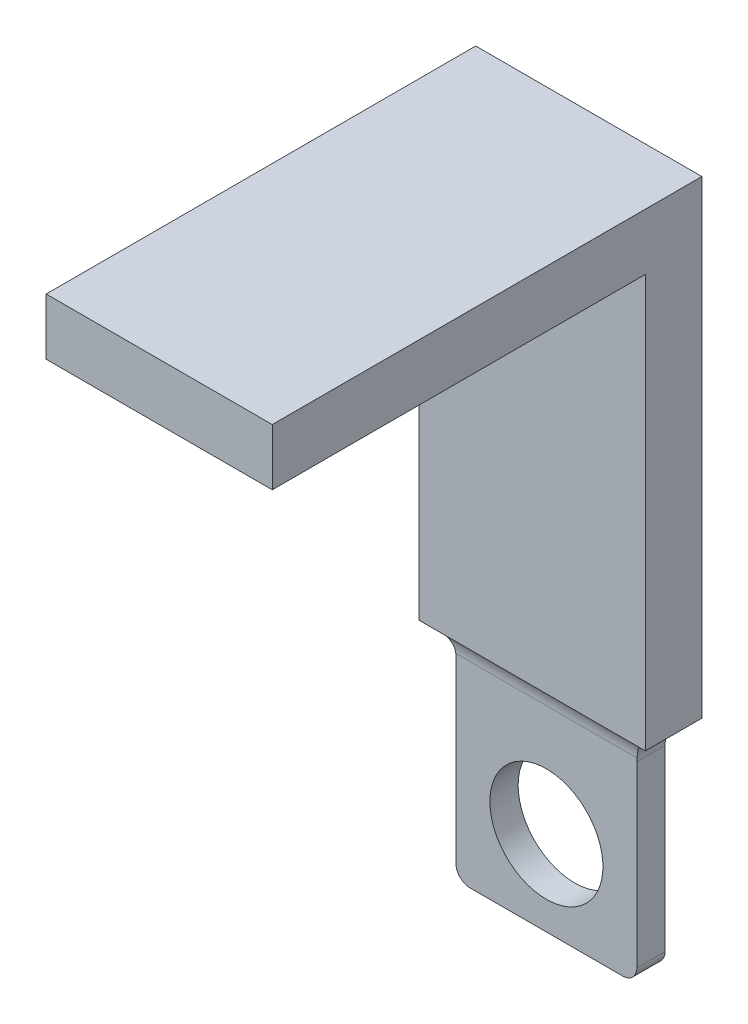
ISO-10303-21;
HEADER;
FILE_DESCRIPTION(('STEP AP214'),'2;1');
FILE_NAME('part.step','',(''),(''),'','','');
FILE_SCHEMA(('AUTOMOTIVE_DESIGN { 1 0 10303 214 1 1 1 1 }'));
ENDSEC;
DATA;
#1=APPLICATION_CONTEXT('core data for automotive mechanical design processes');
#2=APPLICATION_PROTOCOL_DEFINITION('international standard','automotive_design',2000,#1);
#3=PRODUCT_CONTEXT('',#1,'mechanical');
#4=PRODUCT('Part','Part','',(#3));
#5=PRODUCT_RELATED_PRODUCT_CATEGORY('part','',(#4));
#6=PRODUCT_DEFINITION_FORMATION('','',#4);
#7=PRODUCT_DEFINITION_CONTEXT('part definition',#1,'design');
#8=PRODUCT_DEFINITION('design','',#6,#7);
#9=PRODUCT_DEFINITION_SHAPE('','',#8);
#10=(LENGTH_UNIT() NAMED_UNIT(*) SI_UNIT(.MILLI.,.METRE.));
#11=(NAMED_UNIT(*) PLANE_ANGLE_UNIT() SI_UNIT($,.RADIAN.));
#12=(NAMED_UNIT(*) SI_UNIT($,.STERADIAN.) SOLID_ANGLE_UNIT());
#13=UNCERTAINTY_MEASURE_WITH_UNIT(LENGTH_MEASURE(1.E-05),#10,'distance_accuracy_value','');
#14=(GEOMETRIC_REPRESENTATION_CONTEXT(3) GLOBAL_UNCERTAINTY_ASSIGNED_CONTEXT((#13)) GLOBAL_UNIT_ASSIGNED_CONTEXT((#10,
#11,#12)) REPRESENTATION_CONTEXT('',''));
#15=CARTESIAN_POINT('',(0.,0.,0.));
#16=DIRECTION('',(0.,0.,1.));
#17=DIRECTION('',(1.,0.,0.));
#18=AXIS2_PLACEMENT_3D('',#15,#16,#17);
#19=CARTESIAN_POINT('',(0.,8.3,0.));
#20=DIRECTION('',(1.,0.,0.));
#21=DIRECTION('',(0.,0.,-1.));
#22=AXIS2_PLACEMENT_3D('',#19,#20,#21);
#23=PLANE('',#22);
#24=DIRECTION('',(0.,0.,1.));
#25=VECTOR('',#24,1.);
#26=CARTESIAN_POINT('',(0.,0.,0.));
#27=LINE('',#26,#25);
#28=CARTESIAN_POINT('',(0.,0.,0.));
#29=VERTEX_POINT('',#28);
#30=CARTESIAN_POINT('',(0.,0.,1.));
#31=VERTEX_POINT('',#30);
#32=EDGE_CURVE('E160',#29,#31,#27,.T.);
#33=ORIENTED_EDGE('',*,*,#32,.F.);
#34=DIRECTION('',(0.,-1.,0.));
#35=VECTOR('',#34,1.);
#36=CARTESIAN_POINT('',(0.,8.3,0.));
#37=LINE('',#36,#35);
#38=CARTESIAN_POINT('',(0.,8.3,0.));
#39=VERTEX_POINT('',#38);
#40=EDGE_CURVE('E181',#39,#29,#37,.T.);
#41=ORIENTED_EDGE('',*,*,#40,.F.);
#42=DIRECTION('',(0.,0.,1.));
#43=VECTOR('',#42,1.);
#44=CARTESIAN_POINT('',(0.,8.3,0.));
#45=LINE('',#44,#43);
#46=CARTESIAN_POINT('',(0.,8.3,7.6));
#47=VERTEX_POINT('',#46);
#48=EDGE_CURVE('E168',#39,#47,#45,.T.);
#49=ORIENTED_EDGE('',*,*,#48,.T.);
#50=DIRECTION('',(0.,1.,0.));
#51=VECTOR('',#50,1.);
#52=CARTESIAN_POINT('',(0.,8.3,7.6));
#53=LINE('',#52,#51);
#54=CARTESIAN_POINT('',(0.,7.3,7.6));
#55=VERTEX_POINT('',#54);
#56=EDGE_CURVE('E144',#55,#47,#53,.T.);
#57=ORIENTED_EDGE('',*,*,#56,.F.);
#58=DIRECTION('',(0.,0.,-1.));
#59=VECTOR('',#58,1.);
#60=CARTESIAN_POINT('',(0.,7.3,7.6));
#61=LINE('',#60,#59);
#62=CARTESIAN_POINT('',(0.,7.3,1.));
#63=VERTEX_POINT('',#62);
#64=EDGE_CURVE('E140',#55,#63,#61,.T.);
#65=ORIENTED_EDGE('',*,*,#64,.T.);
#66=DIRECTION('',(0.,-1.,0.));
#67=VECTOR('',#66,1.);
#68=CARTESIAN_POINT('',(0.,8.3,1.));
#69=LINE('',#68,#67);
#70=EDGE_CURVE('E174',#63,#31,#69,.T.);
#71=ORIENTED_EDGE('',*,*,#70,.T.);
#72=EDGE_LOOP('',(#33,#41,#49,#57,#65,#71));
#73=FACE_BOUND('',#72,.T.);
#74=ADVANCED_FACE('F32',(#73),#23,.T.);
#75=CARTESIAN_POINT('',(0.,8.3,0.));
#76=DIRECTION('',(0.,0.,1.));
#77=DIRECTION('',(1.,0.,0.));
#78=AXIS2_PLACEMENT_3D('',#75,#76,#77);
#79=PLANE('',#78);
#80=DIRECTION('',(-1.,0.,0.));
#81=VECTOR('',#80,1.);
#82=CARTESIAN_POINT('',(0.,0.,0.));
#83=LINE('',#82,#81);
#84=CARTESIAN_POINT('',(-4.,0.,0.));
#85=VERTEX_POINT('',#84);
#86=EDGE_CURVE('E171',#29,#85,#83,.T.);
#87=ORIENTED_EDGE('',*,*,#86,.T.);
#88=DIRECTION('',(0.,-1.,0.));
#89=VECTOR('',#88,1.);
#90=CARTESIAN_POINT('',(-4.,8.3,0.));
#91=LINE('',#90,#89);
#92=CARTESIAN_POINT('',(-4.,8.3,0.));
#93=VERTEX_POINT('',#92);
#94=EDGE_CURVE('E184',#93,#85,#91,.T.);
#95=ORIENTED_EDGE('',*,*,#94,.F.);
#96=DIRECTION('',(-1.,0.,0.));
#97=VECTOR('',#96,1.);
#98=CARTESIAN_POINT('',(0.,8.3,0.));
#99=LINE('',#98,#97);
#100=EDGE_CURVE('E173',#39,#93,#99,.T.);
#101=ORIENTED_EDGE('',*,*,#100,.F.);
#102=ORIENTED_EDGE('',*,*,#40,.T.);
#103=EDGE_LOOP('',(#87,#95,#101,#102));
#104=FACE_BOUND('',#103,.T.);
#105=ADVANCED_FACE('F271',(#104),#79,.F.);
#106=CARTESIAN_POINT('',(-4.,8.3,0.));
#107=DIRECTION('',(1.,0.,0.));
#108=DIRECTION('',(0.,0.,-1.));
#109=AXIS2_PLACEMENT_3D('',#106,#107,#108);
#110=PLANE('',#109);
#111=DIRECTION('',(0.,0.,1.));
#112=VECTOR('',#111,1.);
#113=CARTESIAN_POINT('',(-4.,0.,0.));
#114=LINE('',#113,#112);
#115=CARTESIAN_POINT('',(-4.,0.,1.));
#116=VERTEX_POINT('',#115);
#117=EDGE_CURVE('E178',#85,#116,#114,.T.);
#118=ORIENTED_EDGE('',*,*,#117,.T.);
#119=DIRECTION('',(0.,-1.,0.));
#120=VECTOR('',#119,1.);
#121=CARTESIAN_POINT('',(-4.,8.3,1.));
#122=LINE('',#121,#120);
#123=CARTESIAN_POINT('',(-4.,7.3,1.));
#124=VERTEX_POINT('',#123);
#125=EDGE_CURVE('E159',#124,#116,#122,.T.);
#126=ORIENTED_EDGE('',*,*,#125,.F.);
#127=DIRECTION('',(0.,0.,-1.));
#128=VECTOR('',#127,1.);
#129=CARTESIAN_POINT('',(-4.,7.3,7.6));
#130=LINE('',#129,#128);
#131=CARTESIAN_POINT('',(-4.,7.3,7.6));
#132=VERTEX_POINT('',#131);
#133=EDGE_CURVE('E138',#132,#124,#130,.T.);
#134=ORIENTED_EDGE('',*,*,#133,.F.);
#135=DIRECTION('',(0.,-1.,0.));
#136=VECTOR('',#135,1.);
#137=CARTESIAN_POINT('',(-4.,8.3,7.6));
#138=LINE('',#137,#136);
#139=CARTESIAN_POINT('',(-4.,8.3,7.6));
#140=VERTEX_POINT('',#139);
#141=EDGE_CURVE('E145',#140,#132,#138,.T.);
#142=ORIENTED_EDGE('',*,*,#141,.F.);
#143=DIRECTION('',(0.,0.,1.));
#144=VECTOR('',#143,1.);
#145=CARTESIAN_POINT('',(-4.,8.3,0.));
#146=LINE('',#145,#144);
#147=EDGE_CURVE('E170',#93,#140,#146,.T.);
#148=ORIENTED_EDGE('',*,*,#147,.F.);
#149=ORIENTED_EDGE('',*,*,#94,.T.);
#150=EDGE_LOOP('',(#118,#126,#134,#142,#148,#149));
#151=FACE_BOUND('',#150,.T.);
#152=ADVANCED_FACE('F158',(#151),#110,.F.);
#153=CARTESIAN_POINT('',(0.,8.3,1.));
#154=DIRECTION('',(0.,0.,1.));
#155=DIRECTION('',(1.,0.,0.));
#156=AXIS2_PLACEMENT_3D('',#153,#154,#155);
#157=PLANE('',#156);
#158=DIRECTION('',(1.,0.,0.));
#159=VECTOR('',#158,1.);
#160=CARTESIAN_POINT('',(-4.,7.3,1.));
#161=LINE('',#160,#159);
#162=EDGE_CURVE('E154',#124,#63,#161,.T.);
#163=ORIENTED_EDGE('',*,*,#162,.F.);
#164=ORIENTED_EDGE('',*,*,#125,.T.);
#165=DIRECTION('',(-1.,0.,0.));
#166=VECTOR('',#165,1.);
#167=CARTESIAN_POINT('',(0.,0.,1.));
#168=LINE('',#167,#166);
#169=EDGE_CURVE('E163',#31,#116,#168,.T.);
#170=ORIENTED_EDGE('',*,*,#169,.F.);
#171=ORIENTED_EDGE('',*,*,#70,.F.);
#172=EDGE_LOOP('',(#163,#164,#170,#171));
#173=FACE_BOUND('',#172,.T.);
#174=ADVANCED_FACE('F280',(#173),#157,.T.);
#175=CARTESIAN_POINT('',(0.,8.3,0.));
#176=DIRECTION('',(0.,-1.,0.));
#177=DIRECTION('',(0.,0.,-1.));
#178=AXIS2_PLACEMENT_3D('',#175,#176,#177);
#179=PLANE('',#178);
#180=ORIENTED_EDGE('',*,*,#48,.F.);
#181=ORIENTED_EDGE('',*,*,#100,.T.);
#182=ORIENTED_EDGE('',*,*,#147,.T.);
#183=DIRECTION('',(-1.,0.,0.));
#184=VECTOR('',#183,1.);
#185=CARTESIAN_POINT('',(-4.,8.3,7.6));
#186=LINE('',#185,#184);
#187=EDGE_CURVE('E151',#47,#140,#186,.T.);
#188=ORIENTED_EDGE('',*,*,#187,.F.);
#189=EDGE_LOOP('',(#180,#181,#182,#188));
#190=FACE_BOUND('',#189,.T.);
#191=ADVANCED_FACE('F283',(#190),#179,.F.);
#192=CARTESIAN_POINT('',(-4.,7.3,7.6));
#193=DIRECTION('',(0.,1.,0.));
#194=DIRECTION('',(0.,0.,1.));
#195=AXIS2_PLACEMENT_3D('',#192,#193,#194);
#196=PLANE('',#195);
#197=ORIENTED_EDGE('',*,*,#162,.T.);
#198=ORIENTED_EDGE('',*,*,#64,.F.);
#199=DIRECTION('',(1.,0.,0.));
#200=VECTOR('',#199,1.);
#201=CARTESIAN_POINT('',(-4.,7.3,7.6));
#202=LINE('',#201,#200);
#203=EDGE_CURVE('E133',#132,#55,#202,.T.);
#204=ORIENTED_EDGE('',*,*,#203,.F.);
#205=ORIENTED_EDGE('',*,*,#133,.T.);
#206=EDGE_LOOP('',(#197,#198,#204,#205));
#207=FACE_BOUND('',#206,.T.);
#208=ADVANCED_FACE('F136',(#207),#196,.F.);
#209=CARTESIAN_POINT('',(0.,0.,7.6));
#210=DIRECTION('',(0.,0.,1.));
#211=DIRECTION('',(1.,0.,0.));
#212=AXIS2_PLACEMENT_3D('',#209,#210,#211);
#213=PLANE('',#212);
#214=ORIENTED_EDGE('',*,*,#141,.T.);
#215=ORIENTED_EDGE('',*,*,#203,.T.);
#216=ORIENTED_EDGE('',*,*,#56,.T.);
#217=ORIENTED_EDGE('',*,*,#187,.T.);
#218=EDGE_LOOP('',(#214,#215,#216,#217));
#219=FACE_BOUND('',#218,.T.);
#220=ADVANCED_FACE('F149',(#219),#213,.T.);
#221=CARTESIAN_POINT('',(-0.4,-3.9,0.25));
#222=DIRECTION('',(-1.,0.,0.));
#223=DIRECTION('',(0.,0.,1.));
#224=AXIS2_PLACEMENT_3D('',#221,#222,#223);
#225=PLANE('',#224);
#226=DIRECTION('',(0.,1.,0.));
#227=VECTOR('',#226,1.);
#228=CARTESIAN_POINT('',(-0.4,-3.9,0.75));
#229=LINE('',#228,#227);
#230=CARTESIAN_POINT('',(-0.4,-3.65,0.75));
#231=VERTEX_POINT('',#230);
#232=CARTESIAN_POINT('',(-0.4,-0.489897948556636,0.75));
#233=VERTEX_POINT('',#232);
#234=EDGE_CURVE('E337',#231,#233,#229,.T.);
#235=ORIENTED_EDGE('',*,*,#234,.F.);
#236=DIRECTION('',(0.,0.,1.));
#237=VECTOR('',#236,1.);
#238=CARTESIAN_POINT('',(-0.4,-3.65,0.25));
#239=LINE('',#238,#237);
#240=CARTESIAN_POINT('',(-0.4,-3.65,0.25));
#241=VERTEX_POINT('',#240);
#242=EDGE_CURVE('E55',#231,#241,#239,.F.);
#243=ORIENTED_EDGE('',*,*,#242,.T.);
#244=DIRECTION('',(0.,1.,0.));
#245=VECTOR('',#244,1.);
#246=CARTESIAN_POINT('',(-0.4,-3.9,0.25));
#247=LINE('',#246,#245);
#248=CARTESIAN_POINT('',(-0.4,-0.489897948556636,0.25));
#249=VERTEX_POINT('',#248);
#250=EDGE_CURVE('E331',#241,#249,#247,.T.);
#251=ORIENTED_EDGE('',*,*,#250,.T.);
#252=DIRECTION('',(0.,0.,1.));
#253=VECTOR('',#252,1.);
#254=CARTESIAN_POINT('',(-0.4,-0.489897948556636,0.25));
#255=LINE('',#254,#253);
#256=EDGE_CURVE('E196',#249,#233,#255,.T.);
#257=ORIENTED_EDGE('',*,*,#256,.T.);
#258=EDGE_LOOP('',(#235,#243,#251,#257));
#259=FACE_BOUND('',#258,.T.);
#260=ADVANCED_FACE('F294',(#259),#225,.F.);
#261=CARTESIAN_POINT('',(-3.6,-3.9,0.75));
#262=DIRECTION('',(0.,0.,-1.));
#263=DIRECTION('',(-1.,0.,0.));
#264=AXIS2_PLACEMENT_3D('',#261,#262,#263);
#265=PLANE('',#264);
#266=CARTESIAN_POINT('',(-2.,-2.39907314828926,0.75));
#267=DIRECTION('',(0.,0.,-1.));
#268=DIRECTION('',(-1.,0.,0.));
#269=AXIS2_PLACEMENT_3D('',#266,#267,#268);
#270=CIRCLE('',#269,1.);
#271=CARTESIAN_POINT('',(-3.,-2.39907314828926,0.75));
#272=VERTEX_POINT('',#271);
#273=EDGE_CURVE('E222',#272,#272,#270,.T.);
#274=ORIENTED_EDGE('',*,*,#273,.T.);
#275=EDGE_LOOP('',(#274));
#276=FACE_BOUND('',#275,.T.);
#277=DIRECTION('',(-1.,0.,0.));
#278=VECTOR('',#277,1.);
#279=CARTESIAN_POINT('',(-3.6,-3.9,0.75));
#280=LINE('',#279,#278);
#281=CARTESIAN_POINT('',(-0.65,-3.9,0.75));
#282=VERTEX_POINT('',#281);
#283=CARTESIAN_POINT('',(-3.35,-3.9,0.75));
#284=VERTEX_POINT('',#283);
#285=EDGE_CURVE('E325',#282,#284,#280,.T.);
#286=ORIENTED_EDGE('',*,*,#285,.F.);
#287=CARTESIAN_POINT('',(-0.65,-3.65,0.75));
#288=DIRECTION('',(0.,0.,-1.));
#289=DIRECTION('',(-1.,0.,0.));
#290=AXIS2_PLACEMENT_3D('',#287,#288,#289);
#291=CIRCLE('',#290,0.25);
#292=EDGE_CURVE('E363',#282,#231,#291,.F.);
#293=ORIENTED_EDGE('',*,*,#292,.T.);
#294=ORIENTED_EDGE('',*,*,#234,.T.);
#295=CARTESIAN_POINT('',(0.1,-0.489897948556636,0.75));
#296=DIRECTION('',(0.,0.,-1.));
#297=DIRECTION('',(-1.,0.,0.));
#298=AXIS2_PLACEMENT_3D('',#295,#296,#297);
#299=CIRCLE('',#298,0.5);
#300=CARTESIAN_POINT('',(-0.396753529138876,-0.433012701892219,0.75));
#301=VERTEX_POINT('',#300);
#302=EDGE_CURVE('E205',#233,#301,#299,.T.);
#303=ORIENTED_EDGE('',*,*,#302,.T.);
#304=DIRECTION('',(-1.,0.,0.));
#305=VECTOR('',#304,1.);
#306=CARTESIAN_POINT('',(-3.6,-0.433012701892219,0.75));
#307=LINE('',#306,#305);
#308=CARTESIAN_POINT('',(-3.60324647086112,-0.433012701892219,0.75));
#309=VERTEX_POINT('',#308);
#310=EDGE_CURVE('E183',#301,#309,#307,.T.);
#311=ORIENTED_EDGE('',*,*,#310,.T.);
#312=CARTESIAN_POINT('',(-4.1,-0.489897948556636,0.75));
#313=DIRECTION('',(0.,0.,-1.));
#314=DIRECTION('',(-1.,0.,0.));
#315=AXIS2_PLACEMENT_3D('',#312,#313,#314);
#316=CIRCLE('',#315,0.5);
#317=CARTESIAN_POINT('',(-3.6,-0.489897948556636,0.75));
#318=VERTEX_POINT('',#317);
#319=EDGE_CURVE('E202',#309,#318,#316,.T.);
#320=ORIENTED_EDGE('',*,*,#319,.T.);
#321=DIRECTION('',(0.,1.,0.));
#322=VECTOR('',#321,1.);
#323=CARTESIAN_POINT('',(-3.6,-3.9,0.75));
#324=LINE('',#323,#322);
#325=CARTESIAN_POINT('',(-3.6,-3.65,0.75));
#326=VERTEX_POINT('',#325);
#327=EDGE_CURVE('E335',#326,#318,#324,.T.);
#328=ORIENTED_EDGE('',*,*,#327,.F.);
#329=CARTESIAN_POINT('',(-3.35,-3.65,0.75));
#330=DIRECTION('',(0.,0.,-1.));
#331=DIRECTION('',(-1.,0.,0.));
#332=AXIS2_PLACEMENT_3D('',#329,#330,#331);
#333=CIRCLE('',#332,0.25);
#334=EDGE_CURVE('E368',#326,#284,#333,.F.);
#335=ORIENTED_EDGE('',*,*,#334,.T.);
#336=EDGE_LOOP('',(#286,#293,#294,#303,#311,#320,#328,#335));
#337=FACE_BOUND('',#336,.T.);
#338=ADVANCED_FACE('F297',(#276,#337),#265,.F.);
#339=CARTESIAN_POINT('',(-3.6,-3.9,0.25));
#340=DIRECTION('',(1.,0.,0.));
#341=DIRECTION('',(0.,0.,-1.));
#342=AXIS2_PLACEMENT_3D('',#339,#340,#341);
#343=PLANE('',#342);
#344=DIRECTION('',(0.,1.,0.));
#345=VECTOR('',#344,1.);
#346=CARTESIAN_POINT('',(-3.6,-3.9,0.25));
#347=LINE('',#346,#345);
#348=CARTESIAN_POINT('',(-3.6,-3.65,0.25));
#349=VERTEX_POINT('',#348);
#350=CARTESIAN_POINT('',(-3.6,-0.489897948556636,0.25));
#351=VERTEX_POINT('',#350);
#352=EDGE_CURVE('E333',#349,#351,#347,.T.);
#353=ORIENTED_EDGE('',*,*,#352,.F.);
#354=DIRECTION('',(0.,0.,-1.));
#355=VECTOR('',#354,1.);
#356=CARTESIAN_POINT('',(-3.6,-3.65,0.25));
#357=LINE('',#356,#355);
#358=EDGE_CURVE('E11',#349,#326,#357,.F.);
#359=ORIENTED_EDGE('',*,*,#358,.T.);
#360=ORIENTED_EDGE('',*,*,#327,.T.);
#361=DIRECTION('',(0.,0.,1.));
#362=VECTOR('',#361,1.);
#363=CARTESIAN_POINT('',(-3.6,-0.489897948556636,0.25));
#364=LINE('',#363,#362);
#365=EDGE_CURVE('E191',#318,#351,#364,.F.);
#366=ORIENTED_EDGE('',*,*,#365,.T.);
#367=EDGE_LOOP('',(#353,#359,#360,#366));
#368=FACE_BOUND('',#367,.T.);
#369=ADVANCED_FACE('F300',(#368),#343,.F.);
#370=CARTESIAN_POINT('',(-3.6,-3.9,0.25));
#371=DIRECTION('',(0.,0.,1.));
#372=DIRECTION('',(1.,0.,0.));
#373=AXIS2_PLACEMENT_3D('',#370,#371,#372);
#374=PLANE('',#373);
#375=CARTESIAN_POINT('',(-2.,-2.39907314828926,0.25));
#376=DIRECTION('',(0.,0.,-1.));
#377=DIRECTION('',(-1.,0.,0.));
#378=AXIS2_PLACEMENT_3D('',#375,#376,#377);
#379=CIRCLE('',#378,1.);
#380=CARTESIAN_POINT('',(-3.,-2.39907314828926,0.25));
#381=VERTEX_POINT('',#380);
#382=EDGE_CURVE('E319',#381,#381,#379,.T.);
#383=ORIENTED_EDGE('',*,*,#382,.F.);
#384=EDGE_LOOP('',(#383));
#385=FACE_BOUND('',#384,.T.);
#386=ORIENTED_EDGE('',*,*,#250,.F.);
#387=CARTESIAN_POINT('',(-0.65,-3.65,0.25));
#388=DIRECTION('',(0.,0.,1.));
#389=DIRECTION('',(1.,0.,0.));
#390=AXIS2_PLACEMENT_3D('',#387,#388,#389);
#391=CIRCLE('',#390,0.25);
#392=CARTESIAN_POINT('',(-0.65,-3.9,0.25));
#393=VERTEX_POINT('',#392);
#394=EDGE_CURVE('E40',#241,#393,#391,.F.);
#395=ORIENTED_EDGE('',*,*,#394,.T.);
#396=DIRECTION('',(1.,0.,0.));
#397=VECTOR('',#396,1.);
#398=CARTESIAN_POINT('',(-3.6,-3.9,0.25));
#399=LINE('',#398,#397);
#400=CARTESIAN_POINT('',(-3.35,-3.9,0.25));
#401=VERTEX_POINT('',#400);
#402=EDGE_CURVE('E328',#401,#393,#399,.T.);
#403=ORIENTED_EDGE('',*,*,#402,.F.);
#404=CARTESIAN_POINT('',(-3.35,-3.65,0.25));
#405=DIRECTION('',(0.,0.,1.));
#406=DIRECTION('',(1.,0.,0.));
#407=AXIS2_PLACEMENT_3D('',#404,#405,#406);
#408=CIRCLE('',#407,0.25);
#409=EDGE_CURVE('E47',#401,#349,#408,.F.);
#410=ORIENTED_EDGE('',*,*,#409,.T.);
#411=ORIENTED_EDGE('',*,*,#352,.T.);
#412=CARTESIAN_POINT('',(-4.1,-0.489897948556636,0.25));
#413=DIRECTION('',(0.,0.,1.));
#414=DIRECTION('',(1.,0.,0.));
#415=AXIS2_PLACEMENT_3D('',#412,#413,#414);
#416=CIRCLE('',#415,0.5);
#417=CARTESIAN_POINT('',(-3.60324647086112,-0.433012701892219,0.25));
#418=VERTEX_POINT('',#417);
#419=EDGE_CURVE('E199',#351,#418,#416,.T.);
#420=ORIENTED_EDGE('',*,*,#419,.T.);
#421=DIRECTION('',(-1.,0.,0.));
#422=VECTOR('',#421,1.);
#423=CARTESIAN_POINT('',(-3.6,-0.433012701892219,0.25));
#424=LINE('',#423,#422);
#425=CARTESIAN_POINT('',(-0.396753529138876,-0.433012701892219,0.25));
#426=VERTEX_POINT('',#425);
#427=EDGE_CURVE('E194',#418,#426,#424,.F.);
#428=ORIENTED_EDGE('',*,*,#427,.T.);
#429=CARTESIAN_POINT('',(0.1,-0.489897948556636,0.25));
#430=DIRECTION('',(0.,0.,1.));
#431=DIRECTION('',(1.,0.,0.));
#432=AXIS2_PLACEMENT_3D('',#429,#430,#431);
#433=CIRCLE('',#432,0.5);
#434=EDGE_CURVE('E208',#426,#249,#433,.T.);
#435=ORIENTED_EDGE('',*,*,#434,.T.);
#436=EDGE_LOOP('',(#386,#395,#403,#410,#411,#420,#428,#435));
#437=FACE_BOUND('',#436,.T.);
#438=ADVANCED_FACE('F304',(#385,#437),#374,.F.);
#439=CARTESIAN_POINT('',(0.,-3.9,0.));
#440=DIRECTION('',(0.,1.,0.));
#441=DIRECTION('',(0.,0.,1.));
#442=AXIS2_PLACEMENT_3D('',#439,#440,#441);
#443=PLANE('',#442);
#444=ORIENTED_EDGE('',*,*,#402,.T.);
#445=DIRECTION('',(0.,0.,1.));
#446=VECTOR('',#445,1.);
#447=CARTESIAN_POINT('',(-0.65,-3.9,0.));
#448=LINE('',#447,#446);
#449=EDGE_CURVE('E372',#393,#282,#448,.T.);
#450=ORIENTED_EDGE('',*,*,#449,.T.);
#451=ORIENTED_EDGE('',*,*,#285,.T.);
#452=DIRECTION('',(0.,0.,-1.));
#453=VECTOR('',#452,1.);
#454=CARTESIAN_POINT('',(-3.35,-3.9,0.));
#455=LINE('',#454,#453);
#456=EDGE_CURVE('E211',#284,#401,#455,.T.);
#457=ORIENTED_EDGE('',*,*,#456,.T.);
#458=EDGE_LOOP('',(#444,#450,#451,#457));
#459=FACE_BOUND('',#458,.T.);
#460=ADVANCED_FACE('F256',(#459),#443,.F.);
#461=CARTESIAN_POINT('',(0.,-0.433012701892219,-0.25));
#462=DIRECTION('',(-1.,0.,0.));
#463=DIRECTION('',(0.,0.,1.));
#464=AXIS2_PLACEMENT_3D('',#461,#462,#463);
#465=CYLINDRICAL_SURFACE('',#464,0.5);
#466=CARTESIAN_POINT('',(-3.60324647086112,-0.433012701892219,0.25));
#467=CARTESIAN_POINT('',(-3.60586092998265,-0.409860841444766,0.250034392457295));
#468=CARTESIAN_POINT('',(-3.61015396514571,-0.386981291483074,0.248395151432066));
#469=CARTESIAN_POINT('',(-3.62165590360276,-0.34259845693376,0.242252526956607));
#470=CARTESIAN_POINT('',(-3.6288359142146,-0.321083911742621,0.237777277693249));
#471=CARTESIAN_POINT('',(-3.6457047951101,-0.279864947448289,0.22645008295588));
#472=CARTESIAN_POINT('',(-3.65538405814626,-0.260153979873397,0.219607205244331));
#473=CARTESIAN_POINT('',(-3.67685270119029,-0.222664090856307,0.204055147013458));
#474=CARTESIAN_POINT('',(-3.68864798869259,-0.204890808276386,0.195340727760496));
#475=CARTESIAN_POINT('',(-3.71953761081972,-0.164073150356729,0.172415762123676));
#476=CARTESIAN_POINT('',(-3.73956149192281,-0.142145235113575,0.157472950122311));
#477=CARTESIAN_POINT('',(-3.78247155998752,-0.102558266559152,0.126082467184274));
#478=CARTESIAN_POINT('',(-3.8053628637902,-0.0849070143253249,0.109632120539839));
#479=CARTESIAN_POINT('',(-3.84218382926366,-0.06123084117243,0.0845425248897215));
#480=CARTESIAN_POINT('',(-3.85517203339427,-0.053679462522895,0.0759250432459844));
#481=CARTESIAN_POINT('',(-3.88189295644402,-0.0397242096768079,0.058941604063969));
#482=CARTESIAN_POINT('',(-3.89562501130938,-0.0333193332642837,0.0505754322205017));
#483=CARTESIAN_POINT('',(-3.92388395312423,-0.0216919572078939,0.0344511619002267));
#484=CARTESIAN_POINT('',(-3.93840859559004,-0.016466314043698,0.0266914836963049));
#485=CARTESIAN_POINT('',(-3.96844439130737,-0.00726221651253476,0.0123224314777308));
#486=CARTESIAN_POINT('',(-3.98395859099324,-0.00328786164564751,0.00571686942269381));
#487=CARTESIAN_POINT('',(-4.,0.,0.));
#488=B_SPLINE_CURVE_WITH_KNOTS('',3,(#466,#467,#468,#469,#470,#471,#472,#473,#474,#475,#476,
#477,#478,#479,#480,#481,#482,#483,#484,#485,#486,#487),.UNSPECIFIED.,.F.,.F.,(4,2,2,2,2,2,2,2,
2,2,4),(0.,0.0696576432679377,0.138634850535326,0.207350754340317,0.276261571621888,
0.375458784020318,0.47483560267138,0.526750120995724,0.578619034192565,0.630348000985059,
0.682244721120778),.UNSPECIFIED.);
#489=EDGE_CURVE('E240',#85,#418,#488,.F.);
#490=ORIENTED_EDGE('',*,*,#489,.F.);
#491=ORIENTED_EDGE('',*,*,#86,.F.);
#492=CARTESIAN_POINT('',(0.534030574121496,-0.241669302490624,0.211939069039892));
#493=CARTESIAN_POINT('',(0.518979686321743,-0.215423765335665,0.201066833269509));
#494=CARTESIAN_POINT('',(0.502021363595925,-0.191222606197442,0.188430223162036));
#495=CARTESIAN_POINT('',(0.465002194955074,-0.146954389868263,0.160908390708452));
#496=CARTESIAN_POINT('',(0.444953610150884,-0.126871695718078,0.14603206001234));
#497=CARTESIAN_POINT('',(0.402473894454575,-0.0907971430517674,0.11530477184608));
#498=CARTESIAN_POINT('',(0.380058548239608,-0.0747803400737393,0.0994605356654851));
#499=CARTESIAN_POINT('',(0.332792058617005,-0.0465376850718261,0.0679305915524337));
#500=CARTESIAN_POINT('',(0.30794009845705,-0.0343131099585643,0.052244938733979));
#501=CARTESIAN_POINT('',(0.267058583251873,-0.0183722320028333,0.0295946599135123));
#502=CARTESIAN_POINT('',(0.251996198388489,-0.0132855302001744,0.0218442551087597));
#503=CARTESIAN_POINT('',(0.220869323786565,-0.00445818126810229,0.00770099583733067));
#504=CARTESIAN_POINT('',(0.204806678022937,-0.000715138552572055,0.00130573373846631));
#505=CARTESIAN_POINT('',(0.17481720064239,0.00465998026782069,-0.00820043186327886));
#506=CARTESIAN_POINT('',(0.161068097117881,0.00655864775445276,-0.0117052764514817));
#507=CARTESIAN_POINT('',(0.133105926441138,0.00920120862981584,-0.016643631744172));
#508=CARTESIAN_POINT('',(0.118894115621588,0.00994799963125716,-0.0180823393060135));
#509=CARTESIAN_POINT('',(0.0903555863327316,0.0102133248938721,-0.0185893933107755));
#510=CARTESIAN_POINT('',(0.076028635597129,0.00972687006875907,-0.0176481115664523));
#511=CARTESIAN_POINT('',(0.0477689678536032,0.00756960537365073,-0.0135849360930247));
#512=CARTESIAN_POINT('',(0.0338372489786802,0.00589603401095753,-0.010457958204631));
#513=CARTESIAN_POINT('',(-1.62487825248691E-05,0.000427004515396443,-0.000653345114118173));
#514=CARTESIAN_POINT('',(-0.0195373010342541,-0.00400577474602621,0.00701273849146775));
#515=CARTESIAN_POINT('',(-0.0571469595728944,-0.0148292309684213,0.0242766730749373));
#516=CARTESIAN_POINT('',(-0.0752289475805774,-0.021228362166615,0.0338828028394366));
#517=CARTESIAN_POINT('',(-0.122361759122841,-0.0409079757117516,0.0609572796750342));
#518=CARTESIAN_POINT('',(-0.150250380514398,-0.0558726877240842,0.0792298755530834));
#519=CARTESIAN_POINT('',(-0.202867481158444,-0.090820189715313,0.115436018087635));
#520=CARTESIAN_POINT('',(-0.227599050815607,-0.110798014690972,0.133369881439988));
#521=CARTESIAN_POINT('',(-0.268072720636158,-0.150597155624354,0.163164320173147));
#522=CARTESIAN_POINT('',(-0.284556619720665,-0.169334938091902,0.175457330432536));
#523=CARTESIAN_POINT('',(-0.314984844314454,-0.209850057564081,0.198033609530129));
#524=CARTESIAN_POINT('',(-0.328932747544393,-0.231623034707171,0.208319711187943));
#525=CARTESIAN_POINT('',(-0.351175010743541,-0.273370364973689,0.22424662031856));
#526=CARTESIAN_POINT('',(-0.360042064388296,-0.292841108907002,0.230404445385502));
#527=CARTESIAN_POINT('',(-0.375321226422804,-0.333266326393081,0.240388726227128));
#528=CARTESIAN_POINT('',(-0.381739577414443,-0.354216863444186,0.24422112527365));
#529=CARTESIAN_POINT('',(-0.388978884252578,-0.385046447431499,0.247784776670135));
#530=CARTESIAN_POINT('',(-0.390921342496231,-0.394553540540671,0.248610801444828));
#531=CARTESIAN_POINT('',(-0.394255143339043,-0.413698508498223,0.249718923426052));
#532=CARTESIAN_POINT('',(-0.395646288856751,-0.423336428843226,0.250000826260802));
#533=CARTESIAN_POINT('',(-0.399215514204319,-0.454528212228146,0.249998162782253));
#534=CARTESIAN_POINT('',(-0.400273843952711,-0.47623334209242,0.248598485199195));
#535=CARTESIAN_POINT('',(-0.399603113892665,-0.519249337392971,0.242986518297271));
#536=CARTESIAN_POINT('',(-0.397869353595843,-0.540559476745324,0.238769492965043));
#537=CARTESIAN_POINT('',(-0.391887454091965,-0.582000115554474,0.227765670281175));
#538=CARTESIAN_POINT('',(-0.38765282656502,-0.602136319940131,0.22099275236782));
#539=CARTESIAN_POINT('',(-0.377076396156407,-0.640903812009973,0.205214511200352));
#540=CARTESIAN_POINT('',(-0.370734225280426,-0.659534836170639,0.196208798151715));
#541=CARTESIAN_POINT('',(-0.353922771808965,-0.701117891391987,0.172924060574906));
#542=CARTESIAN_POINT('',(-0.342783607854547,-0.723377385230407,0.157893985261967));
#543=CARTESIAN_POINT('',(-0.318463935679872,-0.764604188770236,0.125158081298647));
#544=CARTESIAN_POINT('',(-0.305277900139636,-0.783562280312715,0.107445010789895));
#545=CARTESIAN_POINT('',(-0.274180948080831,-0.82271367375601,0.0649198500719467));
#546=CARTESIAN_POINT('',(-0.255936079257195,-0.841933932864975,0.0394625393856439));
#547=CARTESIAN_POINT('',(-0.219498097558735,-0.875282265561388,-0.0146061611903584));
#548=CARTESIAN_POINT('',(-0.201304948065868,-0.889417869864659,-0.0432128039456785));
#549=CARTESIAN_POINT('',(-0.176894658659482,-0.906338863312557,-0.0881420897039896));
#550=CARTESIAN_POINT('',(-0.169413847203677,-0.911182449835952,-0.103006121032378));
#551=CARTESIAN_POINT('',(-0.155836907183705,-0.91956094724338,-0.133708494483386));
#552=CARTESIAN_POINT('',(-0.149738367084182,-0.923098144173729,-0.149545077540125));
#553=CARTESIAN_POINT('',(-0.140720037052392,-0.928162823197452,-0.17922345886832));
#554=CARTESIAN_POINT('',(-0.137423712109841,-0.929938915204811,-0.192903695622317));
#555=CARTESIAN_POINT('',(-0.132908801066143,-0.932346259208001,-0.220687540807895));
#556=CARTESIAN_POINT('',(-0.131684847235235,-0.932980469108672,-0.234789958899948));
#557=CARTESIAN_POINT('',(-0.131566044364523,-0.933042606289505,-0.263051712796811));
#558=CARTESIAN_POINT('',(-0.132678380388027,-0.932466812301419,-0.277211090129439));
#559=CARTESIAN_POINT('',(-0.137005837342694,-0.930163572972181,-0.305120651537491));
#560=CARTESIAN_POINT('',(-0.140226189798004,-0.928433262227236,-0.318869728363429));
#561=CARTESIAN_POINT('',(-0.150335039120559,-0.922772211509165,-0.352805998402937));
#562=CARTESIAN_POINT('',(-0.158262582864198,-0.918161958871304,-0.372557999077101));
#563=CARTESIAN_POINT('',(-0.176047267046359,-0.906922642265982,-0.410647742897603));
#564=CARTESIAN_POINT('',(-0.18591701039194,-0.900280226504959,-0.428975095781121));
#565=CARTESIAN_POINT('',(-0.204912770560417,-0.886314120315451,-0.461616684055282));
#566=CARTESIAN_POINT('',(-0.213919825206483,-0.879252194743389,-0.47611469577627));
#567=CARTESIAN_POINT('',(-0.232142483407463,-0.863828376302408,-0.504274972830712));
#568=CARTESIAN_POINT('',(-0.241358200344555,-0.855465761445907,-0.517936768091642));
#569=CARTESIAN_POINT('',(-0.259506923596183,-0.837624005985679,-0.544170551882719));
#570=CARTESIAN_POINT('',(-0.268441849920595,-0.828171309141543,-0.556759154801284));
#571=CARTESIAN_POINT('',(-0.28598948488009,-0.808003564249989,-0.581104307410518));
#572=CARTESIAN_POINT('',(-0.294602391280031,-0.797289308327954,-0.59286137187326));
#573=CARTESIAN_POINT('',(-0.302944302114034,-0.785931543599274,-0.604186802645371));
#574=B_SPLINE_CURVE_WITH_KNOTS('',3,(#492,#493,#494,#495,#496,#497,#498,#499,#500,#501,#502,
#503,#504,#505,#506,#507,#508,#509,#510,#511,#512,#513,#514,#515,#516,#517,#518,#519,#520,#521,
#522,#523,#524,#525,#526,#527,#528,#529,#530,#531,#532,#533,#534,#535,#536,#537,#538,#539,#540,
#541,#542,#543,#544,#545,#546,#547,#548,#549,#550,#551,#552,#553,#554,#555,#556,#557,#558,#559,
#560,#561,#562,#563,#564,#565,#566,#567,#568,#569,#570,#571,#572,#573),.UNSPECIFIED.,.F.,.F.,(4,
2,2,2,2,2,2,2,2,2,2,2,2,2,2,2,2,2,2,2,2,2,2,2,2,2,2,2,2,2,2,2,2,2,2,2,2,2,2,2,4),(0.,
0.0960260633181465,0.191680494992209,0.286733069401541,0.381817615051,0.434791790902712,
0.487671045374039,0.530454498388303,0.573130150576962,0.615978722040869,0.658927296923784,
0.722869281038708,0.78709012112291,0.896176816067008,1.00515589469721,1.0883245880027,
1.17137502280457,1.23790684488514,1.30426790223427,1.33345659690907,1.36265571647013,
1.42758091603164,1.49261553158609,1.55730195189517,1.6219996729225,1.70875597138938,
1.79575075605353,1.90549120222541,2.0150684396118,2.06697592425733,2.11879214091854,
2.16117723751254,2.20345238190782,2.2458577303037,2.2883687182894,2.35333337204141,
2.41873437490288,2.47408001211237,2.52945648098614,2.58369619220208,2.63790202644005),.UNSPECIFIED.);
#575=EDGE_CURVE('E247',#426,#29,#574,.F.);
#576=ORIENTED_EDGE('',*,*,#575,.F.);
#577=ORIENTED_EDGE('',*,*,#427,.F.);
#578=EDGE_LOOP('',(#490,#491,#576,#577));
#579=FACE_BOUND('',#578,.T.);
#580=ADVANCED_FACE('F253',(#579),#465,.F.);
#581=CARTESIAN_POINT('',(0.1,-0.489897948556636,0.));
#582=DIRECTION('',(0.,0.,1.));
#583=DIRECTION('',(1.,0.,0.));
#584=AXIS2_PLACEMENT_3D('',#581,#582,#583);
#585=CYLINDRICAL_SURFACE('',#584,0.5);
#586=ORIENTED_EDGE('',*,*,#575,.T.);
#587=ORIENTED_EDGE('',*,*,#32,.T.);
#588=CARTESIAN_POINT('',(0.,0.,1.));
#589=CARTESIAN_POINT('',(-0.0146946235751456,-0.00300891776320195,0.994772607199017));
#590=CARTESIAN_POINT('',(-0.028947889698319,-0.00659780489963527,0.988787162211795));
#591=CARTESIAN_POINT('',(-0.0566140185982775,-0.0148378341412773,0.975798844057613));
#592=CARTESIAN_POINT('',(-0.0700292668497375,-0.0194857678838013,0.968799066642897));
#593=CARTESIAN_POINT('',(-0.0961483814290162,-0.029765165288126,0.954243860313943));
#594=CARTESIAN_POINT('',(-0.108852256537188,-0.0353966168070043,0.946688438260593));
#595=CARTESIAN_POINT('',(-0.133626303013498,-0.0476201969668583,0.93130067111001));
#596=CARTESIAN_POINT('',(-0.145695931819089,-0.0542131304726704,0.923468098209208));
#597=CARTESIAN_POINT('',(-0.180732913564206,-0.0752569408860994,0.900076499365554));
#598=CARTESIAN_POINT('',(-0.202835465401737,-0.0910954194986005,0.88443981072968));
#599=CARTESIAN_POINT('',(-0.244589938652742,-0.126571651160946,0.854224868496091));
#600=CARTESIAN_POINT('',(-0.264242977192348,-0.146207661803519,0.839646133684198));
#601=CARTESIAN_POINT('',(-0.297242550179886,-0.185385450750289,0.815129659012624));
#602=CARTESIAN_POINT('',(-0.311084198580727,-0.204280469230922,0.804831482970895));
#603=CARTESIAN_POINT('',(-0.336328203588463,-0.244580190365583,0.786337629927599));
#604=CARTESIAN_POINT('',(-0.347733093786767,-0.26598225013924,0.77813976736524));
#605=CARTESIAN_POINT('',(-0.365932920904524,-0.307328755296066,0.765652897982903));
#606=CARTESIAN_POINT('',(-0.373175132642984,-0.326949016098762,0.760946112573284));
#607=CARTESIAN_POINT('',(-0.385193302484719,-0.367312366132852,0.753915756310136));
#608=CARTESIAN_POINT('',(-0.389975779116476,-0.38805232499432,0.75158587014559));
#609=CARTESIAN_POINT('',(-0.394725772641397,-0.417007976042018,0.750191255118413));
#610=CARTESIAN_POINT('',(-0.395838839756956,-0.42500046401856,0.74999729047438));
#611=CARTESIAN_POINT('',(-0.396753529138876,-0.433012701892219,0.75));
#612=B_SPLINE_CURVE_WITH_KNOTS('',3,(#588,#589,#590,#591,#592,#593,#594,#595,#596,#597,#598,
#599,#600,#601,#602,#603,#604,#605,#606,#607,#608,#609,#610,#611),.UNSPECIFIED.,.F.,.F.,(4,2,2,
2,2,2,2,2,2,2,2,4),(0.,0.0475485937024291,0.0949550111725433,0.142360843384545,
0.189806589672369,0.283573398548833,0.37729728638939,0.453785156875694,0.530193108741918,
0.59424193068279,0.658120131152051,0.682317446448176),.UNSPECIFIED.);
#613=EDGE_CURVE('E221',#301,#31,#612,.F.);
#614=ORIENTED_EDGE('',*,*,#613,.F.);
#615=ORIENTED_EDGE('',*,*,#302,.F.);
#616=ORIENTED_EDGE('',*,*,#256,.F.);
#617=ORIENTED_EDGE('',*,*,#434,.F.);
#618=EDGE_LOOP('',(#586,#587,#614,#615,#616,#617));
#619=FACE_BOUND('',#618,.T.);
#620=ADVANCED_FACE('F235',(#619),#585,.F.);
#621=CARTESIAN_POINT('',(-4.1,-0.489897948556636,0.));
#622=DIRECTION('',(0.,0.,1.));
#623=DIRECTION('',(1.,0.,0.));
#624=AXIS2_PLACEMENT_3D('',#621,#622,#623);
#625=CYLINDRICAL_SURFACE('',#624,0.5);
#626=ORIENTED_EDGE('',*,*,#365,.F.);
#627=ORIENTED_EDGE('',*,*,#319,.F.);
#628=CARTESIAN_POINT('',(-4.53403057412149,-0.241669302490622,0.788060930960109));
#629=CARTESIAN_POINT('',(-4.51897968632174,-0.215423765335662,0.798933166730492));
#630=CARTESIAN_POINT('',(-4.50202136359592,-0.19122260619744,0.811569776837965));
#631=CARTESIAN_POINT('',(-4.46500219495507,-0.146954389868261,0.839091609291549));
#632=CARTESIAN_POINT('',(-4.44495361015088,-0.126871695718076,0.853967939987662));
#633=CARTESIAN_POINT('',(-4.40247389445457,-0.0907971430517659,0.884695228153921));
#634=CARTESIAN_POINT('',(-4.3800585482396,-0.0747803400737378,0.900539464334516));
#635=CARTESIAN_POINT('',(-4.332792058617,-0.0465376850718248,0.932069408447568));
#636=CARTESIAN_POINT('',(-4.30794009845705,-0.0343131099585631,0.947755061266023));
#637=CARTESIAN_POINT('',(-4.26705858325187,-0.0183722320028322,0.970405340086489));
#638=CARTESIAN_POINT('',(-4.25199619838848,-0.0132855302001733,0.978155744891242));
#639=CARTESIAN_POINT('',(-4.22086932378656,-0.00445818126810155,0.99229900416267));
#640=CARTESIAN_POINT('',(-4.20480667802293,-0.000715138552571619,0.998694266261535));
#641=CARTESIAN_POINT('',(-4.17481720064239,0.00465998026782085,1.00820043186328));
#642=CARTESIAN_POINT('',(-4.16106809711788,0.00655864775445291,1.01170527645148));
#643=CARTESIAN_POINT('',(-4.13310592644113,0.00920120862981587,1.01664363174417));
#644=CARTESIAN_POINT('',(-4.11889411562159,0.00994799963125708,1.01808233930601));
#645=CARTESIAN_POINT('',(-4.09035558633273,0.0102133248938719,1.01858939331078));
#646=CARTESIAN_POINT('',(-4.07602863559713,0.00972687006875876,1.01764811156645));
#647=CARTESIAN_POINT('',(-4.0477689678536,0.00756960537365041,1.01358493609302));
#648=CARTESIAN_POINT('',(-4.03383724897868,0.00589603401095728,1.01045795820463));
#649=CARTESIAN_POINT('',(-3.99998375121747,0.000427004515396103,1.00065334511412));
#650=CARTESIAN_POINT('',(-3.98046269896574,-0.00400577474602685,0.992987261508531));
#651=CARTESIAN_POINT('',(-3.9428530404271,-0.0148292309684222,0.975723326925061));
#652=CARTESIAN_POINT('',(-3.92477105241942,-0.0212283621666159,0.966117197160562));
#653=CARTESIAN_POINT('',(-3.87763824087716,-0.0409079757117526,0.939042720324965));
#654=CARTESIAN_POINT('',(-3.8497496194856,-0.0558726877240855,0.920770124446915));
#655=CARTESIAN_POINT('',(-3.79713251884155,-0.0908201897153147,0.884563981912363));
#656=CARTESIAN_POINT('',(-3.77240094918439,-0.110798014690974,0.86663011856001));
#657=CARTESIAN_POINT('',(-3.73192727936384,-0.150597155624356,0.836835679826851));
#658=CARTESIAN_POINT('',(-3.71544338027933,-0.169334938091904,0.824542669567462));
#659=CARTESIAN_POINT('',(-3.68501515568554,-0.209850057564083,0.80196639046987));
#660=CARTESIAN_POINT('',(-3.67106725245561,-0.231623034707173,0.791680288812056));
#661=CARTESIAN_POINT('',(-3.64882498925646,-0.273370364973691,0.77575337968144));
#662=CARTESIAN_POINT('',(-3.6399579356117,-0.292841108907004,0.769595554614497));
#663=CARTESIAN_POINT('',(-3.6246787735772,-0.333266326393083,0.759611273772871));
#664=CARTESIAN_POINT('',(-3.61826042258556,-0.354216863444188,0.75577887472635));
#665=CARTESIAN_POINT('',(-3.61102111574742,-0.385046447431501,0.752215223329865));
#666=CARTESIAN_POINT('',(-3.60907865750377,-0.394553540540672,0.751389198555172));
#667=CARTESIAN_POINT('',(-3.60574485666096,-0.413698508498224,0.750281076573948));
#668=CARTESIAN_POINT('',(-3.60435371114325,-0.423336428843226,0.749999173739198));
#669=CARTESIAN_POINT('',(-3.60078448579568,-0.454528212228146,0.750001837217746));
#670=CARTESIAN_POINT('',(-3.59972615604729,-0.47623334209242,0.751401514800805));
#671=CARTESIAN_POINT('',(-3.60039688610733,-0.519249337392971,0.757013481702729));
#672=CARTESIAN_POINT('',(-3.60213064640416,-0.540559476745324,0.761230507034957));
#673=CARTESIAN_POINT('',(-3.60811254590803,-0.582000115554474,0.772234329718825));
#674=CARTESIAN_POINT('',(-3.61234717343498,-0.602136319940131,0.77900724763218));
#675=CARTESIAN_POINT('',(-3.62292360384359,-0.640903812009973,0.794785488799648));
#676=CARTESIAN_POINT('',(-3.62926577471957,-0.659534836170639,0.803791201848285));
#677=CARTESIAN_POINT('',(-3.64607722819103,-0.701117891391986,0.827075939425094));
#678=CARTESIAN_POINT('',(-3.65721639214545,-0.723377385230407,0.842106014738033));
#679=CARTESIAN_POINT('',(-3.68153606432013,-0.764604188770236,0.874841918701353));
#680=CARTESIAN_POINT('',(-3.69472209986036,-0.783562280312715,0.892554989210105));
#681=CARTESIAN_POINT('',(-3.72581905191917,-0.82271367375601,0.935080149928053));
#682=CARTESIAN_POINT('',(-3.7440639207428,-0.841933932864975,0.960537460614356));
#683=CARTESIAN_POINT('',(-3.78050190244126,-0.875282265561388,1.01460616119036));
#684=CARTESIAN_POINT('',(-3.79869505193413,-0.889417869864659,1.04321280394568));
#685=CARTESIAN_POINT('',(-3.82310534134052,-0.906338863312557,1.08814208970399));
#686=CARTESIAN_POINT('',(-3.83058615279632,-0.911182449835952,1.10300612103238));
#687=CARTESIAN_POINT('',(-3.84416309281629,-0.91956094724338,1.13370849448339));
#688=CARTESIAN_POINT('',(-3.85026163291582,-0.923098144173729,1.14954507754012));
#689=CARTESIAN_POINT('',(-3.85927996294761,-0.928162823197452,1.17922345886832));
#690=CARTESIAN_POINT('',(-3.86257628789016,-0.929938915204811,1.19290369562232));
#691=CARTESIAN_POINT('',(-3.86709119893386,-0.932346259208001,1.2206875408079));
#692=CARTESIAN_POINT('',(-3.86831515276476,-0.932980469108672,1.23478995889995));
#693=CARTESIAN_POINT('',(-3.86843395563548,-0.933042606289505,1.26305171279681));
#694=CARTESIAN_POINT('',(-3.86732161961197,-0.932466812301419,1.27721109012944));
#695=CARTESIAN_POINT('',(-3.8629941626573,-0.930163572972181,1.30512065153749));
#696=CARTESIAN_POINT('',(-3.85977381020199,-0.928433262227236,1.31886972836343));
#697=CARTESIAN_POINT('',(-3.84966496087944,-0.922772211509164,1.35280599840294));
#698=CARTESIAN_POINT('',(-3.8417374171358,-0.918161958871304,1.3725579990771));
#699=CARTESIAN_POINT('',(-3.82395273295364,-0.906922642265982,1.4106477428976));
#700=CARTESIAN_POINT('',(-3.81408298960806,-0.900280226504959,1.42897509578112));
#701=CARTESIAN_POINT('',(-3.79508722943958,-0.886314120315451,1.46161668405528));
#702=CARTESIAN_POINT('',(-3.78608017479352,-0.879252194743389,1.47611469577627));
#703=CARTESIAN_POINT('',(-3.76785751659254,-0.863828376302409,1.50427497283071));
#704=CARTESIAN_POINT('',(-3.75864179965544,-0.855465761445908,1.51793676809164));
#705=CARTESIAN_POINT('',(-3.74049307640382,-0.837624005985679,1.54417055188272));
#706=CARTESIAN_POINT('',(-3.7315581500794,-0.828171309141543,1.55675915480128));
#707=CARTESIAN_POINT('',(-3.71401051511991,-0.808003564249988,1.58110430741052));
#708=CARTESIAN_POINT('',(-3.70539760871997,-0.797289308327953,1.59286137187326));
#709=CARTESIAN_POINT('',(-3.69705569788597,-0.785931543599274,1.60418680264537));
#710=B_SPLINE_CURVE_WITH_KNOTS('',3,(#628,#629,#630,#631,#632,#633,#634,#635,#636,#637,#638,
#639,#640,#641,#642,#643,#644,#645,#646,#647,#648,#649,#650,#651,#652,#653,#654,#655,#656,#657,
#658,#659,#660,#661,#662,#663,#664,#665,#666,#667,#668,#669,#670,#671,#672,#673,#674,#675,#676,
#677,#678,#679,#680,#681,#682,#683,#684,#685,#686,#687,#688,#689,#690,#691,#692,#693,#694,#695,
#696,#697,#698,#699,#700,#701,#702,#703,#704,#705,#706,#707,#708,#709),.UNSPECIFIED.,.F.,.F.,(4,
2,2,2,2,2,2,2,2,2,2,2,2,2,2,2,2,2,2,2,2,2,2,2,2,2,2,2,2,2,2,2,2,2,2,2,2,2,2,2,4),(0.,
0.0960260633181468,0.19168049499221,0.286733069401542,0.381817615051001,0.434791790902714,
0.48767104537404,0.530454498388303,0.573130150576961,0.615978722040868,0.658927296923782,
0.722869281038708,0.78709012112291,0.896176816067008,1.00515589469721,1.0883245880027,
1.17137502280457,1.23790684488514,1.30426790223427,1.33345659690907,1.36265571647012,
1.42758091603164,1.49261553158609,1.55730195189517,1.6219996729225,1.70875597138937,
1.79575075605352,1.9054912022254,2.0150684396118,2.06697592425733,2.11879214091854,
2.16117723751254,2.20345238190782,2.24585773030369,2.2883687182894,2.35333337204141,
2.41873437490287,2.47408001211236,2.52945648098614,2.58369619220207,2.63790202644005),.UNSPECIFIED.);
#711=EDGE_CURVE('E212',#116,#309,#710,.T.);
#712=ORIENTED_EDGE('',*,*,#711,.F.);
#713=ORIENTED_EDGE('',*,*,#117,.F.);
#714=ORIENTED_EDGE('',*,*,#489,.T.);
#715=ORIENTED_EDGE('',*,*,#419,.F.);
#716=EDGE_LOOP('',(#626,#627,#712,#713,#714,#715));
#717=FACE_BOUND('',#716,.T.);
#718=ADVANCED_FACE('F232',(#717),#625,.F.);
#719=CARTESIAN_POINT('',(0.,-0.433012701892219,1.25));
#720=DIRECTION('',(-1.,0.,0.));
#721=DIRECTION('',(0.,0.,1.));
#722=AXIS2_PLACEMENT_3D('',#719,#720,#721);
#723=CYLINDRICAL_SURFACE('',#722,0.5);
#724=ORIENTED_EDGE('',*,*,#613,.T.);
#725=ORIENTED_EDGE('',*,*,#169,.T.);
#726=ORIENTED_EDGE('',*,*,#711,.T.);
#727=ORIENTED_EDGE('',*,*,#310,.F.);
#728=EDGE_LOOP('',(#724,#725,#726,#727));
#729=FACE_BOUND('',#728,.T.);
#730=ADVANCED_FACE('F229',(#729),#723,.F.);
#731=CARTESIAN_POINT('',(-0.65,-3.65,0.));
#732=DIRECTION('',(0.,0.,1.));
#733=DIRECTION('',(1.,0.,0.));
#734=AXIS2_PLACEMENT_3D('',#731,#732,#733);
#735=CYLINDRICAL_SURFACE('',#734,0.25);
#736=ORIENTED_EDGE('',*,*,#394,.F.);
#737=ORIENTED_EDGE('',*,*,#242,.F.);
#738=ORIENTED_EDGE('',*,*,#292,.F.);
#739=ORIENTED_EDGE('',*,*,#449,.F.);
#740=EDGE_LOOP('',(#736,#737,#738,#739));
#741=FACE_BOUND('',#740,.T.);
#742=ADVANCED_FACE('F258',(#741),#735,.T.);
#743=CARTESIAN_POINT('',(-3.35,-3.65,0.));
#744=DIRECTION('',(0.,0.,-1.));
#745=DIRECTION('',(-1.,0.,0.));
#746=AXIS2_PLACEMENT_3D('',#743,#744,#745);
#747=CYLINDRICAL_SURFACE('',#746,0.25);
#748=ORIENTED_EDGE('',*,*,#334,.F.);
#749=ORIENTED_EDGE('',*,*,#358,.F.);
#750=ORIENTED_EDGE('',*,*,#409,.F.);
#751=ORIENTED_EDGE('',*,*,#456,.F.);
#752=EDGE_LOOP('',(#748,#749,#750,#751));
#753=FACE_BOUND('',#752,.T.);
#754=ADVANCED_FACE('F34',(#753),#747,.T.);
#755=CARTESIAN_POINT('',(-2.,-2.39907314828926,4.15));
#756=DIRECTION('',(0.,0.,-1.));
#757=DIRECTION('',(-1.,0.,0.));
#758=AXIS2_PLACEMENT_3D('',#755,#756,#757);
#759=CYLINDRICAL_SURFACE('',#758,1.);
#760=ORIENTED_EDGE('',*,*,#382,.T.);
#761=EDGE_LOOP('',(#760));
#762=FACE_BOUND('',#761,.T.);
#763=ORIENTED_EDGE('',*,*,#273,.F.);
#764=EDGE_LOOP('',(#763));
#765=FACE_BOUND('',#764,.T.);
#766=ADVANCED_FACE('F266',(#762,#765),#759,.F.);
#767=CLOSED_SHELL('',(#74,#105,#152,#174,#191,#208,#220,#260,#338,#369,#438,#460,#580,#620,#718,
#730,#742,#754,#766));
#768=MANIFOLD_SOLID_BREP('B2',#767);
#769=ADVANCED_BREP_SHAPE_REPRESENTATION('',(#18,#768),#14);
#770=SHAPE_DEFINITION_REPRESENTATION(#9,#769);
ENDSEC;
END-ISO-10303-21;
